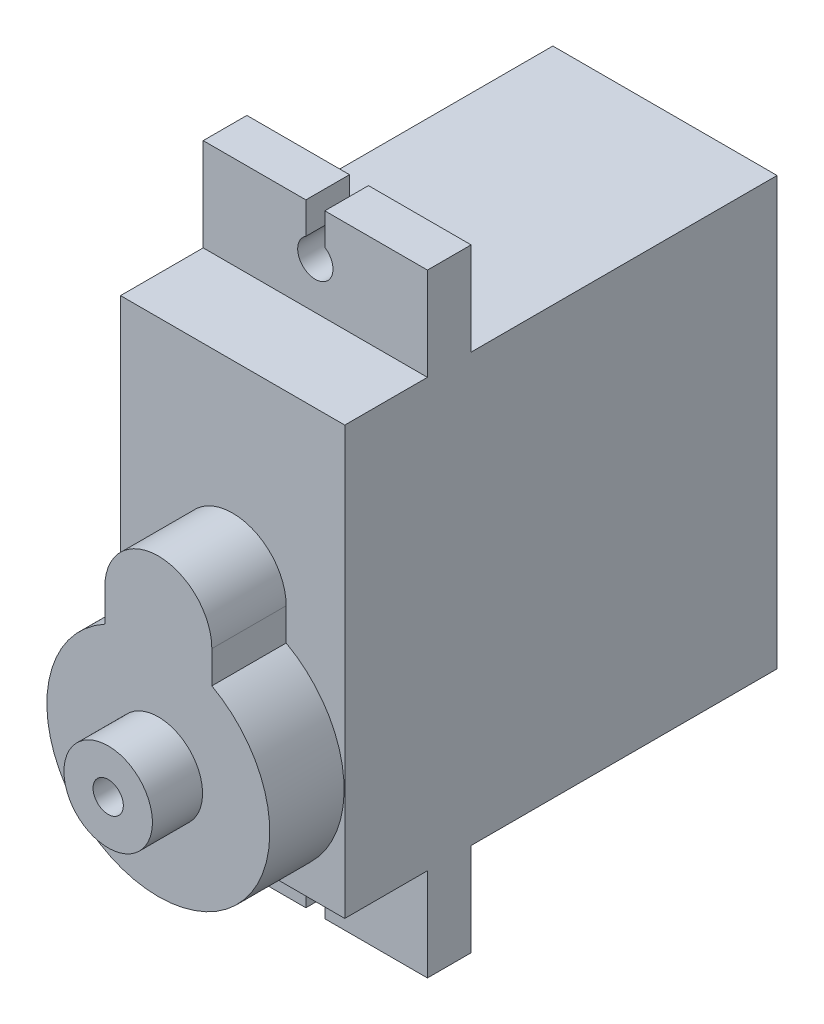
ISO-10303-21;
HEADER;
FILE_DESCRIPTION(('STEP AP214'),'2;1');
FILE_NAME('part.step','',(''),(''),'','','');
FILE_SCHEMA(('AUTOMOTIVE_DESIGN { 1 0 10303 214 1 1 1 1 }'));
ENDSEC;
DATA;
#1=APPLICATION_CONTEXT('core data for automotive mechanical design processes');
#2=APPLICATION_PROTOCOL_DEFINITION('international standard','automotive_design',2000,#1);
#3=PRODUCT_CONTEXT('',#1,'mechanical');
#4=PRODUCT('Part','Part','',(#3));
#5=PRODUCT_RELATED_PRODUCT_CATEGORY('part','',(#4));
#6=PRODUCT_DEFINITION_FORMATION('','',#4);
#7=PRODUCT_DEFINITION_CONTEXT('part definition',#1,'design');
#8=PRODUCT_DEFINITION('design','',#6,#7);
#9=PRODUCT_DEFINITION_SHAPE('','',#8);
#10=(LENGTH_UNIT() NAMED_UNIT(*) SI_UNIT(.MILLI.,.METRE.));
#11=(NAMED_UNIT(*) PLANE_ANGLE_UNIT() SI_UNIT($,.RADIAN.));
#12=(NAMED_UNIT(*) SI_UNIT($,.STERADIAN.) SOLID_ANGLE_UNIT());
#13=UNCERTAINTY_MEASURE_WITH_UNIT(LENGTH_MEASURE(1.E-05),#10,'distance_accuracy_value','');
#14=(GEOMETRIC_REPRESENTATION_CONTEXT(3) GLOBAL_UNCERTAINTY_ASSIGNED_CONTEXT((#13)) GLOBAL_UNIT_ASSIGNED_CONTEXT((#10,
#11,#12)) REPRESENTATION_CONTEXT('',''));
#15=CARTESIAN_POINT('',(0.,0.,0.));
#16=DIRECTION('',(0.,0.,1.));
#17=DIRECTION('',(1.,0.,0.));
#18=AXIS2_PLACEMENT_3D('',#15,#16,#17);
#19=CARTESIAN_POINT('',(6.035,6.,4.));
#20=DIRECTION('',(0.,0.,1.));
#21=DIRECTION('',(1.,0.,0.));
#22=AXIS2_PLACEMENT_3D('',#19,#20,#21);
#23=PLANE('',#22);
#24=CARTESIAN_POINT('',(6.035,6.,4.));
#25=DIRECTION('',(0.,0.,1.));
#26=DIRECTION('',(1.,0.,0.));
#27=AXIS2_PLACEMENT_3D('',#24,#25,#26);
#28=CIRCLE('',#27,6.);
#29=CARTESIAN_POINT('',(3.155,11.2636109278707,4.));
#30=VERTEX_POINT('',#29);
#31=CARTESIAN_POINT('',(8.915,11.2636109278707,4.));
#32=VERTEX_POINT('',#31);
#33=EDGE_CURVE('E274',#30,#32,#28,.T.);
#34=ORIENTED_EDGE('',*,*,#33,.T.);
#35=DIRECTION('',(0.,1.,0.));
#36=VECTOR('',#35,1.);
#37=CARTESIAN_POINT('',(8.915,11.2636109278707,4.));
#38=LINE('',#37,#36);
#39=CARTESIAN_POINT('',(8.915,13.,4.));
#40=VERTEX_POINT('',#39);
#41=EDGE_CURVE('E256',#32,#40,#38,.T.);
#42=ORIENTED_EDGE('',*,*,#41,.T.);
#43=CARTESIAN_POINT('',(6.035,13.,4.));
#44=DIRECTION('',(0.,0.,1.));
#45=DIRECTION('',(1.,0.,0.));
#46=AXIS2_PLACEMENT_3D('',#43,#44,#45);
#47=CIRCLE('',#46,2.88);
#48=CARTESIAN_POINT('',(3.155,13.,4.));
#49=VERTEX_POINT('',#48);
#50=EDGE_CURVE('E249',#40,#49,#47,.T.);
#51=ORIENTED_EDGE('',*,*,#50,.T.);
#52=DIRECTION('',(0.,-1.,0.));
#53=VECTOR('',#52,1.);
#54=CARTESIAN_POINT('',(3.155,13.,4.));
#55=LINE('',#54,#53);
#56=EDGE_CURVE('E252',#49,#30,#55,.T.);
#57=ORIENTED_EDGE('',*,*,#56,.T.);
#58=EDGE_LOOP('',(#34,#42,#51,#57));
#59=FACE_BOUND('',#58,.T.);
#60=CARTESIAN_POINT('',(6.035,6.,4.));
#61=DIRECTION('',(0.,0.,1.));
#62=DIRECTION('',(1.,0.,0.));
#63=AXIS2_PLACEMENT_3D('',#60,#61,#62);
#64=CIRCLE('',#63,2.38);
#65=CARTESIAN_POINT('',(3.655,6.,4.));
#66=VERTEX_POINT('',#65);
#67=EDGE_CURVE('E772',#66,#66,#64,.T.);
#68=ORIENTED_EDGE('',*,*,#67,.F.);
#69=EDGE_LOOP('',(#68));
#70=FACE_BOUND('',#69,.T.);
#71=ADVANCED_FACE('F36',(#59,#70),#23,.T.);
#72=CARTESIAN_POINT('',(0.,-5.,-4.45));
#73=DIRECTION('',(0.,1.,0.));
#74=DIRECTION('',(0.,0.,1.));
#75=AXIS2_PLACEMENT_3D('',#72,#73,#74);
#76=PLANE('',#75);
#77=DIRECTION('',(1.,0.,0.));
#78=VECTOR('',#77,1.);
#79=CARTESIAN_POINT('',(12.07,-5.,-6.8));
#80=LINE('',#79,#78);
#81=CARTESIAN_POINT('',(0.,-5.,-6.8));
#82=VERTEX_POINT('',#81);
#83=CARTESIAN_POINT('',(5.525,-5.,-6.8));
#84=VERTEX_POINT('',#83);
#85=EDGE_CURVE('E378',#82,#84,#80,.T.);
#86=ORIENTED_EDGE('',*,*,#85,.T.);
#87=DIRECTION('',(0.,0.,1.));
#88=VECTOR('',#87,1.);
#89=CARTESIAN_POINT('',(5.525,-5.,-23.270025));
#90=LINE('',#89,#88);
#91=CARTESIAN_POINT('',(5.52500000000001,-5.,-4.45000000000001));
#92=VERTEX_POINT('',#91);
#93=EDGE_CURVE('E205',#84,#92,#90,.T.);
#94=ORIENTED_EDGE('',*,*,#93,.T.);
#95=DIRECTION('',(-1.,0.,0.));
#96=VECTOR('',#95,1.);
#97=CARTESIAN_POINT('',(0.,-5.,-4.45));
#98=LINE('',#97,#96);
#99=CARTESIAN_POINT('',(0.,-5.,-4.45));
#100=VERTEX_POINT('',#99);
#101=EDGE_CURVE('E225',#92,#100,#98,.T.);
#102=ORIENTED_EDGE('',*,*,#101,.T.);
#103=DIRECTION('',(0.,0.,-1.));
#104=VECTOR('',#103,1.);
#105=CARTESIAN_POINT('',(0.,-5.,-6.8));
#106=LINE('',#105,#104);
#107=EDGE_CURVE('E239',#100,#82,#106,.T.);
#108=ORIENTED_EDGE('',*,*,#107,.T.);
#109=EDGE_LOOP('',(#86,#94,#102,#108));
#110=FACE_BOUND('',#109,.T.);
#111=ADVANCED_FACE('F392',(#110),#76,.F.);
#112=CARTESIAN_POINT('',(0.,28.,-6.8));
#113=DIRECTION('',(0.,-1.,0.));
#114=DIRECTION('',(0.,0.,-1.));
#115=AXIS2_PLACEMENT_3D('',#112,#113,#114);
#116=PLANE('',#115);
#117=DIRECTION('',(-1.,0.,0.));
#118=VECTOR('',#117,1.);
#119=CARTESIAN_POINT('',(0.,28.,-6.8));
#120=LINE('',#119,#118);
#121=CARTESIAN_POINT('',(12.07,28.,-6.8));
#122=VERTEX_POINT('',#121);
#123=CARTESIAN_POINT('',(6.545,28.,-6.8));
#124=VERTEX_POINT('',#123);
#125=EDGE_CURVE('E418',#122,#124,#120,.T.);
#126=ORIENTED_EDGE('',*,*,#125,.T.);
#127=DIRECTION('',(0.,0.,1.));
#128=VECTOR('',#127,1.);
#129=CARTESIAN_POINT('',(6.545,28.,-23.270025));
#130=LINE('',#129,#128);
#131=CARTESIAN_POINT('',(6.545,28.,-4.45000000000001));
#132=VERTEX_POINT('',#131);
#133=EDGE_CURVE('E450',#124,#132,#130,.T.);
#134=ORIENTED_EDGE('',*,*,#133,.T.);
#135=DIRECTION('',(1.,0.,0.));
#136=VECTOR('',#135,1.);
#137=CARTESIAN_POINT('',(12.07,28.,-4.45000000000001));
#138=LINE('',#137,#136);
#139=CARTESIAN_POINT('',(12.07,28.,-4.45000000000001));
#140=VERTEX_POINT('',#139);
#141=EDGE_CURVE('E413',#132,#140,#138,.T.);
#142=ORIENTED_EDGE('',*,*,#141,.T.);
#143=DIRECTION('',(0.,0.,-1.));
#144=VECTOR('',#143,1.);
#145=CARTESIAN_POINT('',(12.07,28.,-6.8));
#146=LINE('',#145,#144);
#147=EDGE_CURVE('E349',#140,#122,#146,.T.);
#148=ORIENTED_EDGE('',*,*,#147,.T.);
#149=EDGE_LOOP('',(#126,#134,#142,#148));
#150=FACE_BOUND('',#149,.T.);
#151=ADVANCED_FACE('F466',(#150),#116,.F.);
#152=CARTESIAN_POINT('',(0.,23.,0.));
#153=DIRECTION('',(0.,1.,0.));
#154=DIRECTION('',(0.,0.,1.));
#155=AXIS2_PLACEMENT_3D('',#152,#153,#154);
#156=PLANE('',#155);
#157=DIRECTION('',(-1.,0.,0.));
#158=VECTOR('',#157,1.);
#159=CARTESIAN_POINT('',(0.,23.,-6.8));
#160=LINE('',#159,#158);
#161=CARTESIAN_POINT('',(12.07,23.,-6.8));
#162=VERTEX_POINT('',#161);
#163=CARTESIAN_POINT('',(0.,23.,-6.8));
#164=VERTEX_POINT('',#163);
#165=EDGE_CURVE('E366',#162,#164,#160,.T.);
#166=ORIENTED_EDGE('',*,*,#165,.F.);
#167=DIRECTION('',(0.,0.,-1.));
#168=VECTOR('',#167,1.);
#169=CARTESIAN_POINT('',(12.07,23.,0.));
#170=LINE('',#169,#168);
#171=CARTESIAN_POINT('',(12.07,23.,-23.27));
#172=VERTEX_POINT('',#171);
#173=EDGE_CURVE('E323',#162,#172,#170,.T.);
#174=ORIENTED_EDGE('',*,*,#173,.T.);
#175=DIRECTION('',(-1.,0.,0.));
#176=VECTOR('',#175,1.);
#177=CARTESIAN_POINT('',(12.07,23.,-23.27));
#178=LINE('',#177,#176);
#179=CARTESIAN_POINT('',(0.,23.,-23.27));
#180=VERTEX_POINT('',#179);
#181=EDGE_CURVE('E305',#172,#180,#178,.T.);
#182=ORIENTED_EDGE('',*,*,#181,.T.);
#183=DIRECTION('',(0.,0.,1.));
#184=VECTOR('',#183,1.);
#185=CARTESIAN_POINT('',(0.,23.,-23.27));
#186=LINE('',#185,#184);
#187=EDGE_CURVE('E290',#180,#164,#186,.T.);
#188=ORIENTED_EDGE('',*,*,#187,.T.);
#189=EDGE_LOOP('',(#166,#174,#182,#188));
#190=FACE_BOUND('',#189,.T.);
#191=ADVANCED_FACE('F472',(#190),#156,.T.);
#192=CARTESIAN_POINT('',(0.,0.,0.));
#193=DIRECTION('',(0.,1.,0.));
#194=DIRECTION('',(0.,0.,1.));
#195=AXIS2_PLACEMENT_3D('',#192,#193,#194);
#196=PLANE('',#195);
#197=DIRECTION('',(1.,0.,0.));
#198=VECTOR('',#197,1.);
#199=CARTESIAN_POINT('',(12.07,0.,-6.8));
#200=LINE('',#199,#198);
#201=CARTESIAN_POINT('',(0.,0.,-6.8));
#202=VERTEX_POINT('',#201);
#203=CARTESIAN_POINT('',(12.07,0.,-6.8));
#204=VERTEX_POINT('',#203);
#205=EDGE_CURVE('E233',#202,#204,#200,.T.);
#206=ORIENTED_EDGE('',*,*,#205,.F.);
#207=DIRECTION('',(0.,0.,1.));
#208=VECTOR('',#207,1.);
#209=CARTESIAN_POINT('',(0.,0.,-23.27));
#210=LINE('',#209,#208);
#211=CARTESIAN_POINT('',(0.,0.,-23.27));
#212=VERTEX_POINT('',#211);
#213=EDGE_CURVE('E316',#212,#202,#210,.T.);
#214=ORIENTED_EDGE('',*,*,#213,.F.);
#215=DIRECTION('',(-1.,0.,0.));
#216=VECTOR('',#215,1.);
#217=CARTESIAN_POINT('',(12.07,0.,-23.27));
#218=LINE('',#217,#216);
#219=CARTESIAN_POINT('',(12.07,0.,-23.27));
#220=VERTEX_POINT('',#219);
#221=EDGE_CURVE('E306',#220,#212,#218,.T.);
#222=ORIENTED_EDGE('',*,*,#221,.F.);
#223=DIRECTION('',(0.,0.,-1.));
#224=VECTOR('',#223,1.);
#225=CARTESIAN_POINT('',(12.07,0.,0.));
#226=LINE('',#225,#224);
#227=EDGE_CURVE('E311',#204,#220,#226,.T.);
#228=ORIENTED_EDGE('',*,*,#227,.F.);
#229=EDGE_LOOP('',(#206,#214,#222,#228));
#230=FACE_BOUND('',#229,.T.);
#231=ADVANCED_FACE('F475',(#230),#196,.F.);
#232=DIRECTION('',(-1.,0.,0.));
#233=VECTOR('',#232,1.);
#234=CARTESIAN_POINT('',(0.,0.,-4.45));
#235=LINE('',#234,#233);
#236=CARTESIAN_POINT('',(12.07,0.,-4.45));
#237=VERTEX_POINT('',#236);
#238=CARTESIAN_POINT('',(0.,0.,-4.45));
#239=VERTEX_POINT('',#238);
#240=EDGE_CURVE('E236',#237,#239,#235,.T.);
#241=ORIENTED_EDGE('',*,*,#240,.F.);
#242=CARTESIAN_POINT('',(12.07,0.,0.));
#243=VERTEX_POINT('',#242);
#244=EDGE_CURVE('E308',#243,#237,#226,.T.);
#245=ORIENTED_EDGE('',*,*,#244,.F.);
#246=DIRECTION('',(1.,0.,0.));
#247=VECTOR('',#246,1.);
#248=CARTESIAN_POINT('',(0.,0.,0.));
#249=LINE('',#248,#247);
#250=CARTESIAN_POINT('',(6.035,0.,0.));
#251=VERTEX_POINT('',#250);
#252=EDGE_CURVE('E315',#251,#243,#249,.T.);
#253=ORIENTED_EDGE('',*,*,#252,.F.);
#254=CARTESIAN_POINT('',(0.,0.,0.));
#255=VERTEX_POINT('',#254);
#256=EDGE_CURVE('E312',#255,#251,#249,.T.);
#257=ORIENTED_EDGE('',*,*,#256,.F.);
#258=EDGE_CURVE('E277',#239,#255,#210,.T.);
#259=ORIENTED_EDGE('',*,*,#258,.F.);
#260=EDGE_LOOP('',(#241,#245,#253,#257,#259));
#261=FACE_BOUND('',#260,.T.);
#262=ADVANCED_FACE('F477',(#261),#196,.F.);
#263=CARTESIAN_POINT('',(0.,23.,0.));
#264=DIRECTION('',(0.,0.,-1.));
#265=DIRECTION('',(-1.,0.,0.));
#266=AXIS2_PLACEMENT_3D('',#263,#264,#265);
#267=PLANE('',#266);
#268=DIRECTION('',(0.,-1.,0.));
#269=VECTOR('',#268,1.);
#270=CARTESIAN_POINT('',(3.155,13.,0.));
#271=LINE('',#270,#269);
#272=CARTESIAN_POINT('',(3.155,13.,0.));
#273=VERTEX_POINT('',#272);
#274=CARTESIAN_POINT('',(3.155,11.2636109278707,0.));
#275=VERTEX_POINT('',#274);
#276=EDGE_CURVE('E261',#273,#275,#271,.T.);
#277=ORIENTED_EDGE('',*,*,#276,.F.);
#278=CARTESIAN_POINT('',(6.035,13.,0.));
#279=DIRECTION('',(0.,0.,1.));
#280=DIRECTION('',(1.,0.,0.));
#281=AXIS2_PLACEMENT_3D('',#278,#279,#280);
#282=CIRCLE('',#281,2.88);
#283=CARTESIAN_POINT('',(8.915,13.,0.));
#284=VERTEX_POINT('',#283);
#285=EDGE_CURVE('E248',#284,#273,#282,.T.);
#286=ORIENTED_EDGE('',*,*,#285,.F.);
#287=DIRECTION('',(0.,1.,0.));
#288=VECTOR('',#287,1.);
#289=CARTESIAN_POINT('',(8.915,11.2636109278707,0.));
#290=LINE('',#289,#288);
#291=CARTESIAN_POINT('',(8.915,11.2636109278707,0.));
#292=VERTEX_POINT('',#291);
#293=EDGE_CURVE('E253',#292,#284,#290,.T.);
#294=ORIENTED_EDGE('',*,*,#293,.F.);
#295=CARTESIAN_POINT('',(6.035,6.,0.));
#296=DIRECTION('',(0.,0.,1.));
#297=DIRECTION('',(1.,0.,0.));
#298=AXIS2_PLACEMENT_3D('',#295,#296,#297);
#299=CIRCLE('',#298,6.);
#300=EDGE_CURVE('E278',#251,#292,#299,.T.);
#301=ORIENTED_EDGE('',*,*,#300,.F.);
#302=ORIENTED_EDGE('',*,*,#252,.T.);
#303=DIRECTION('',(0.,-1.,0.));
#304=VECTOR('',#303,1.);
#305=CARTESIAN_POINT('',(12.07,23.,0.));
#306=LINE('',#305,#304);
#307=CARTESIAN_POINT('',(12.07,23.,0.));
#308=VERTEX_POINT('',#307);
#309=EDGE_CURVE('E296',#308,#243,#306,.T.);
#310=ORIENTED_EDGE('',*,*,#309,.F.);
#311=DIRECTION('',(1.,0.,0.));
#312=VECTOR('',#311,1.);
#313=CARTESIAN_POINT('',(0.,23.,0.));
#314=LINE('',#313,#312);
#315=CARTESIAN_POINT('',(0.,23.,0.));
#316=VERTEX_POINT('',#315);
#317=EDGE_CURVE('E283',#316,#308,#314,.T.);
#318=ORIENTED_EDGE('',*,*,#317,.F.);
#319=DIRECTION('',(0.,-1.,0.));
#320=VECTOR('',#319,1.);
#321=CARTESIAN_POINT('',(0.,23.,0.));
#322=LINE('',#321,#320);
#323=EDGE_CURVE('E292',#316,#255,#322,.T.);
#324=ORIENTED_EDGE('',*,*,#323,.T.);
#325=ORIENTED_EDGE('',*,*,#256,.T.);
#326=EDGE_CURVE('E273',#275,#251,#299,.T.);
#327=ORIENTED_EDGE('',*,*,#326,.F.);
#328=EDGE_LOOP('',(#277,#286,#294,#301,#302,#310,#318,#324,#325,#327));
#329=FACE_BOUND('',#328,.T.);
#330=ADVANCED_FACE('F338',(#329),#267,.F.);
#331=CARTESIAN_POINT('',(6.035,6.,4.));
#332=DIRECTION('',(0.,0.,-1.));
#333=DIRECTION('',(-1.,0.,0.));
#334=AXIS2_PLACEMENT_3D('',#331,#332,#333);
#335=CYLINDRICAL_SURFACE('',#334,6.);
#336=DIRECTION('',(0.,0.,-1.));
#337=VECTOR('',#336,1.);
#338=CARTESIAN_POINT('',(3.155,11.2636109278707,4.));
#339=LINE('',#338,#337);
#340=EDGE_CURVE('E268',#30,#275,#339,.T.);
#341=ORIENTED_EDGE('',*,*,#340,.T.);
#342=ORIENTED_EDGE('',*,*,#326,.T.);
#343=ORIENTED_EDGE('',*,*,#300,.T.);
#344=DIRECTION('',(0.,0.,-1.));
#345=VECTOR('',#344,1.);
#346=CARTESIAN_POINT('',(8.915,11.2636109278707,4.));
#347=LINE('',#346,#345);
#348=EDGE_CURVE('E266',#32,#292,#347,.T.);
#349=ORIENTED_EDGE('',*,*,#348,.F.);
#350=ORIENTED_EDGE('',*,*,#33,.F.);
#351=EDGE_LOOP('',(#341,#342,#343,#349,#350));
#352=FACE_BOUND('',#351,.T.);
#353=ADVANCED_FACE('F564',(#352),#335,.T.);
#354=CARTESIAN_POINT('',(0.,23.,-23.27));
#355=DIRECTION('',(1.,0.,0.));
#356=DIRECTION('',(0.,0.,-1.));
#357=AXIS2_PLACEMENT_3D('',#354,#355,#356);
#358=PLANE('',#357);
#359=ORIENTED_EDGE('',*,*,#213,.T.);
#360=DIRECTION('',(0.,1.,0.));
#361=VECTOR('',#360,1.);
#362=CARTESIAN_POINT('',(0.,-5.,-6.8));
#363=LINE('',#362,#361);
#364=EDGE_CURVE('E245',#82,#202,#363,.T.);
#365=ORIENTED_EDGE('',*,*,#364,.F.);
#366=ORIENTED_EDGE('',*,*,#107,.F.);
#367=DIRECTION('',(0.,1.,0.));
#368=VECTOR('',#367,1.);
#369=CARTESIAN_POINT('',(0.,-5.,-4.45));
#370=LINE('',#369,#368);
#371=EDGE_CURVE('E224',#100,#239,#370,.T.);
#372=ORIENTED_EDGE('',*,*,#371,.T.);
#373=ORIENTED_EDGE('',*,*,#258,.T.);
#374=ORIENTED_EDGE('',*,*,#323,.F.);
#375=CARTESIAN_POINT('',(0.,23.,-4.45));
#376=VERTEX_POINT('',#375);
#377=EDGE_CURVE('E287',#376,#316,#186,.T.);
#378=ORIENTED_EDGE('',*,*,#377,.F.);
#379=DIRECTION('',(0.,-1.,0.));
#380=VECTOR('',#379,1.);
#381=CARTESIAN_POINT('',(0.,28.,-4.45));
#382=LINE('',#381,#380);
#383=CARTESIAN_POINT('',(0.,28.,-4.45));
#384=VERTEX_POINT('',#383);
#385=EDGE_CURVE('E237',#384,#376,#382,.T.);
#386=ORIENTED_EDGE('',*,*,#385,.F.);
#387=DIRECTION('',(0.,0.,1.));
#388=VECTOR('',#387,1.);
#389=CARTESIAN_POINT('',(0.,28.,-4.45));
#390=LINE('',#389,#388);
#391=CARTESIAN_POINT('',(0.,28.,-6.8));
#392=VERTEX_POINT('',#391);
#393=EDGE_CURVE('E370',#392,#384,#390,.T.);
#394=ORIENTED_EDGE('',*,*,#393,.F.);
#395=DIRECTION('',(0.,-1.,0.));
#396=VECTOR('',#395,1.);
#397=CARTESIAN_POINT('',(0.,28.,-6.8));
#398=LINE('',#397,#396);
#399=EDGE_CURVE('E357',#392,#164,#398,.T.);
#400=ORIENTED_EDGE('',*,*,#399,.T.);
#401=ORIENTED_EDGE('',*,*,#187,.F.);
#402=DIRECTION('',(0.,-1.,0.));
#403=VECTOR('',#402,1.);
#404=CARTESIAN_POINT('',(0.,23.,-23.27));
#405=LINE('',#404,#403);
#406=EDGE_CURVE('E302',#180,#212,#405,.T.);
#407=ORIENTED_EDGE('',*,*,#406,.T.);
#408=EDGE_LOOP('',(#359,#365,#366,#372,#373,#374,#378,#386,#394,#400,#401,#407));
#409=FACE_BOUND('',#408,.T.);
#410=ADVANCED_FACE('F38',(#409),#358,.F.);
#411=CARTESIAN_POINT('',(12.07,23.,0.));
#412=DIRECTION('',(-1.,0.,0.));
#413=DIRECTION('',(0.,0.,1.));
#414=AXIS2_PLACEMENT_3D('',#411,#412,#413);
#415=PLANE('',#414);
#416=ORIENTED_EDGE('',*,*,#244,.T.);
#417=DIRECTION('',(0.,1.,0.));
#418=VECTOR('',#417,1.);
#419=CARTESIAN_POINT('',(12.07,-5.,-4.45));
#420=LINE('',#419,#418);
#421=CARTESIAN_POINT('',(12.07,-5.,-4.45));
#422=VERTEX_POINT('',#421);
#423=EDGE_CURVE('E228',#422,#237,#420,.T.);
#424=ORIENTED_EDGE('',*,*,#423,.F.);
#425=DIRECTION('',(0.,0.,1.));
#426=VECTOR('',#425,1.);
#427=CARTESIAN_POINT('',(12.07,-5.,-4.45));
#428=LINE('',#427,#426);
#429=CARTESIAN_POINT('',(12.07,-5.,-6.8));
#430=VERTEX_POINT('',#429);
#431=EDGE_CURVE('E222',#430,#422,#428,.T.);
#432=ORIENTED_EDGE('',*,*,#431,.F.);
#433=DIRECTION('',(0.,1.,0.));
#434=VECTOR('',#433,1.);
#435=CARTESIAN_POINT('',(12.07,-5.,-6.8));
#436=LINE('',#435,#434);
#437=EDGE_CURVE('E242',#430,#204,#436,.T.);
#438=ORIENTED_EDGE('',*,*,#437,.T.);
#439=ORIENTED_EDGE('',*,*,#227,.T.);
#440=DIRECTION('',(0.,-1.,0.));
#441=VECTOR('',#440,1.);
#442=CARTESIAN_POINT('',(12.07,23.,-23.27));
#443=LINE('',#442,#441);
#444=EDGE_CURVE('E299',#172,#220,#443,.T.);
#445=ORIENTED_EDGE('',*,*,#444,.F.);
#446=ORIENTED_EDGE('',*,*,#173,.F.);
#447=DIRECTION('',(0.,-1.,0.));
#448=VECTOR('',#447,1.);
#449=CARTESIAN_POINT('',(12.07,28.,-6.8));
#450=LINE('',#449,#448);
#451=EDGE_CURVE('E352',#122,#162,#450,.T.);
#452=ORIENTED_EDGE('',*,*,#451,.F.);
#453=ORIENTED_EDGE('',*,*,#147,.F.);
#454=DIRECTION('',(0.,-1.,0.));
#455=VECTOR('',#454,1.);
#456=CARTESIAN_POINT('',(12.07,28.,-4.45000000000001));
#457=LINE('',#456,#455);
#458=CARTESIAN_POINT('',(12.07,23.,-4.45000000000001));
#459=VERTEX_POINT('',#458);
#460=EDGE_CURVE('E347',#140,#459,#457,.T.);
#461=ORIENTED_EDGE('',*,*,#460,.T.);
#462=EDGE_CURVE('E319',#308,#459,#170,.T.);
#463=ORIENTED_EDGE('',*,*,#462,.F.);
#464=ORIENTED_EDGE('',*,*,#309,.T.);
#465=EDGE_LOOP('',(#416,#424,#432,#438,#439,#445,#446,#452,#453,#461,#463,#464));
#466=FACE_BOUND('',#465,.T.);
#467=ADVANCED_FACE('F344',(#466),#415,.F.);
#468=CARTESIAN_POINT('',(12.07,23.,-23.27));
#469=DIRECTION('',(0.,0.,1.));
#470=DIRECTION('',(1.,0.,0.));
#471=AXIS2_PLACEMENT_3D('',#468,#469,#470);
#472=PLANE('',#471);
#473=ORIENTED_EDGE('',*,*,#221,.T.);
#474=ORIENTED_EDGE('',*,*,#406,.F.);
#475=ORIENTED_EDGE('',*,*,#181,.F.);
#476=ORIENTED_EDGE('',*,*,#444,.T.);
#477=EDGE_LOOP('',(#473,#474,#475,#476));
#478=FACE_BOUND('',#477,.T.);
#479=ADVANCED_FACE('F471',(#478),#472,.F.);
#480=DIRECTION('',(1.,0.,0.));
#481=VECTOR('',#480,1.);
#482=CARTESIAN_POINT('',(12.07,23.,-4.45000000000001));
#483=LINE('',#482,#481);
#484=EDGE_CURVE('E360',#376,#459,#483,.T.);
#485=ORIENTED_EDGE('',*,*,#484,.F.);
#486=ORIENTED_EDGE('',*,*,#377,.T.);
#487=ORIENTED_EDGE('',*,*,#317,.T.);
#488=ORIENTED_EDGE('',*,*,#462,.T.);
#489=EDGE_LOOP('',(#485,#486,#487,#488));
#490=FACE_BOUND('',#489,.T.);
#491=ADVANCED_FACE('F333',(#490),#156,.T.);
#492=CARTESIAN_POINT('',(6.035,13.,4.));
#493=DIRECTION('',(0.,0.,-1.));
#494=DIRECTION('',(-1.,0.,0.));
#495=AXIS2_PLACEMENT_3D('',#492,#493,#494);
#496=CYLINDRICAL_SURFACE('',#495,2.88);
#497=ORIENTED_EDGE('',*,*,#285,.T.);
#498=DIRECTION('',(0.,0.,-1.));
#499=VECTOR('',#498,1.);
#500=CARTESIAN_POINT('',(3.155,13.,4.));
#501=LINE('',#500,#499);
#502=EDGE_CURVE('E271',#49,#273,#501,.T.);
#503=ORIENTED_EDGE('',*,*,#502,.F.);
#504=ORIENTED_EDGE('',*,*,#50,.F.);
#505=DIRECTION('',(0.,0.,-1.));
#506=VECTOR('',#505,1.);
#507=CARTESIAN_POINT('',(8.915,13.,4.));
#508=LINE('',#507,#506);
#509=EDGE_CURVE('E258',#40,#284,#508,.T.);
#510=ORIENTED_EDGE('',*,*,#509,.T.);
#511=EDGE_LOOP('',(#497,#503,#504,#510));
#512=FACE_BOUND('',#511,.T.);
#513=ADVANCED_FACE('F549',(#512),#496,.T.);
#514=CARTESIAN_POINT('',(3.155,13.,4.));
#515=DIRECTION('',(1.,0.,0.));
#516=DIRECTION('',(0.,0.,-1.));
#517=AXIS2_PLACEMENT_3D('',#514,#515,#516);
#518=PLANE('',#517);
#519=ORIENTED_EDGE('',*,*,#276,.T.);
#520=ORIENTED_EDGE('',*,*,#340,.F.);
#521=ORIENTED_EDGE('',*,*,#56,.F.);
#522=ORIENTED_EDGE('',*,*,#502,.T.);
#523=EDGE_LOOP('',(#519,#520,#521,#522));
#524=FACE_BOUND('',#523,.T.);
#525=ADVANCED_FACE('F546',(#524),#518,.F.);
#526=CARTESIAN_POINT('',(8.915,11.2636109278707,4.));
#527=DIRECTION('',(-1.,0.,0.));
#528=DIRECTION('',(0.,0.,1.));
#529=AXIS2_PLACEMENT_3D('',#526,#527,#528);
#530=PLANE('',#529);
#531=ORIENTED_EDGE('',*,*,#293,.T.);
#532=ORIENTED_EDGE('',*,*,#509,.F.);
#533=ORIENTED_EDGE('',*,*,#41,.F.);
#534=ORIENTED_EDGE('',*,*,#348,.T.);
#535=EDGE_LOOP('',(#531,#532,#533,#534));
#536=FACE_BOUND('',#535,.T.);
#537=ADVANCED_FACE('F543',(#536),#530,.F.);
#538=CARTESIAN_POINT('',(12.07,-5.,-6.8));
#539=DIRECTION('',(0.,0.,1.));
#540=DIRECTION('',(1.,0.,0.));
#541=AXIS2_PLACEMENT_3D('',#538,#539,#540);
#542=PLANE('',#541);
#543=CARTESIAN_POINT('',(6.035,-2.5,-6.8));
#544=DIRECTION('',(0.,0.,1.));
#545=DIRECTION('',(1.,0.,0.));
#546=AXIS2_PLACEMENT_3D('',#543,#544,#545);
#547=CIRCLE('',#546,0.95);
#548=CARTESIAN_POINT('',(6.545,-3.30149859638055,-6.8));
#549=VERTEX_POINT('',#548);
#550=CARTESIAN_POINT('',(5.525,-3.30149859638055,-6.8));
#551=VERTEX_POINT('',#550);
#552=EDGE_CURVE('E398',#549,#551,#547,.T.);
#553=ORIENTED_EDGE('',*,*,#552,.T.);
#554=DIRECTION('',(0.,-1.,0.));
#555=VECTOR('',#554,1.);
#556=CARTESIAN_POINT('',(5.525,-5.,-6.8));
#557=LINE('',#556,#555);
#558=EDGE_CURVE('E51',#551,#84,#557,.T.);
#559=ORIENTED_EDGE('',*,*,#558,.T.);
#560=ORIENTED_EDGE('',*,*,#85,.F.);
#561=ORIENTED_EDGE('',*,*,#364,.T.);
#562=ORIENTED_EDGE('',*,*,#205,.T.);
#563=ORIENTED_EDGE('',*,*,#437,.F.);
#564=CARTESIAN_POINT('',(6.545,-5.,-6.8));
#565=VERTEX_POINT('',#564);
#566=EDGE_CURVE('E377',#565,#430,#80,.T.);
#567=ORIENTED_EDGE('',*,*,#566,.F.);
#568=DIRECTION('',(0.,1.,0.));
#569=VECTOR('',#568,1.);
#570=CARTESIAN_POINT('',(6.545,-5.,-6.8));
#571=LINE('',#570,#569);
#572=EDGE_CURVE('E201',#565,#549,#571,.T.);
#573=ORIENTED_EDGE('',*,*,#572,.T.);
#574=EDGE_LOOP('',(#553,#559,#560,#561,#562,#563,#567,#573));
#575=FACE_BOUND('',#574,.T.);
#576=ADVANCED_FACE('F385',(#575),#542,.F.);
#577=CARTESIAN_POINT('',(0.,-5.,-4.45));
#578=DIRECTION('',(0.,0.,-1.));
#579=DIRECTION('',(-1.,0.,0.));
#580=AXIS2_PLACEMENT_3D('',#577,#578,#579);
#581=PLANE('',#580);
#582=ORIENTED_EDGE('',*,*,#101,.F.);
#583=DIRECTION('',(0.,-1.,0.));
#584=VECTOR('',#583,1.);
#585=CARTESIAN_POINT('',(5.525,-2.5,-4.45000000000001));
#586=LINE('',#585,#584);
#587=CARTESIAN_POINT('',(5.525,-3.30149859638055,-4.45000000000001));
#588=VERTEX_POINT('',#587);
#589=EDGE_CURVE('E206',#588,#92,#586,.T.);
#590=ORIENTED_EDGE('',*,*,#589,.F.);
#591=CARTESIAN_POINT('',(6.035,-2.5,-4.45));
#592=DIRECTION('',(0.,0.,1.));
#593=DIRECTION('',(-1.,0.,0.));
#594=AXIS2_PLACEMENT_3D('',#591,#592,#593);
#595=CIRCLE('',#594,0.95);
#596=CARTESIAN_POINT('',(6.545,-3.30149859638055,-4.45));
#597=VERTEX_POINT('',#596);
#598=EDGE_CURVE('E217',#597,#588,#595,.T.);
#599=ORIENTED_EDGE('',*,*,#598,.F.);
#600=DIRECTION('',(0.,1.,0.));
#601=VECTOR('',#600,1.);
#602=CARTESIAN_POINT('',(6.545,-2.5,-4.45000000000001));
#603=LINE('',#602,#601);
#604=CARTESIAN_POINT('',(6.545,-5.,-4.45000000000001));
#605=VERTEX_POINT('',#604);
#606=EDGE_CURVE('E59',#605,#597,#603,.T.);
#607=ORIENTED_EDGE('',*,*,#606,.F.);
#608=EDGE_CURVE('E214',#422,#605,#98,.T.);
#609=ORIENTED_EDGE('',*,*,#608,.F.);
#610=ORIENTED_EDGE('',*,*,#423,.T.);
#611=ORIENTED_EDGE('',*,*,#240,.T.);
#612=ORIENTED_EDGE('',*,*,#371,.F.);
#613=EDGE_LOOP('',(#582,#590,#599,#607,#609,#610,#611,#612));
#614=FACE_BOUND('',#613,.T.);
#615=ADVANCED_FACE('F212',(#614),#581,.F.);
#616=ORIENTED_EDGE('',*,*,#608,.T.);
#617=DIRECTION('',(0.,0.,1.));
#618=VECTOR('',#617,1.);
#619=CARTESIAN_POINT('',(6.545,-5.,-23.270025));
#620=LINE('',#619,#618);
#621=EDGE_CURVE('E198',#565,#605,#620,.T.);
#622=ORIENTED_EDGE('',*,*,#621,.F.);
#623=ORIENTED_EDGE('',*,*,#566,.T.);
#624=ORIENTED_EDGE('',*,*,#431,.T.);
#625=EDGE_LOOP('',(#616,#622,#623,#624));
#626=FACE_BOUND('',#625,.T.);
#627=ADVANCED_FACE('F220',(#626),#76,.F.);
#628=CARTESIAN_POINT('',(12.07,28.,-4.45000000000001));
#629=DIRECTION('',(0.,0.,-1.));
#630=DIRECTION('',(-1.,0.,0.));
#631=AXIS2_PLACEMENT_3D('',#628,#629,#630);
#632=PLANE('',#631);
#633=ORIENTED_EDGE('',*,*,#141,.F.);
#634=DIRECTION('',(0.,1.,0.));
#635=VECTOR('',#634,1.);
#636=CARTESIAN_POINT('',(6.545,28.,-4.45000000000001));
#637=LINE('',#636,#635);
#638=CARTESIAN_POINT('',(6.545,26.3014985963806,-4.45000000000001));
#639=VERTEX_POINT('',#638);
#640=EDGE_CURVE('E444',#639,#132,#637,.T.);
#641=ORIENTED_EDGE('',*,*,#640,.F.);
#642=CARTESIAN_POINT('',(6.035,25.5,-4.45));
#643=DIRECTION('',(0.,0.,1.));
#644=DIRECTION('',(1.,0.,0.));
#645=AXIS2_PLACEMENT_3D('',#642,#643,#644);
#646=CIRCLE('',#645,0.95);
#647=CARTESIAN_POINT('',(5.525,26.3014985963806,-4.45));
#648=VERTEX_POINT('',#647);
#649=EDGE_CURVE('E401',#648,#639,#646,.T.);
#650=ORIENTED_EDGE('',*,*,#649,.F.);
#651=DIRECTION('',(0.,-1.,0.));
#652=VECTOR('',#651,1.);
#653=CARTESIAN_POINT('',(5.52500000000001,28.,-4.45000000000001));
#654=LINE('',#653,#652);
#655=CARTESIAN_POINT('',(5.52500000000001,28.,-4.45000000000001));
#656=VERTEX_POINT('',#655);
#657=EDGE_CURVE('E440',#656,#648,#654,.T.);
#658=ORIENTED_EDGE('',*,*,#657,.F.);
#659=EDGE_CURVE('E414',#384,#656,#138,.T.);
#660=ORIENTED_EDGE('',*,*,#659,.F.);
#661=ORIENTED_EDGE('',*,*,#385,.T.);
#662=ORIENTED_EDGE('',*,*,#484,.T.);
#663=ORIENTED_EDGE('',*,*,#460,.F.);
#664=EDGE_LOOP('',(#633,#641,#650,#658,#660,#661,#662,#663));
#665=FACE_BOUND('',#664,.T.);
#666=ADVANCED_FACE('F437',(#665),#632,.F.);
#667=CARTESIAN_POINT('',(0.,28.,-6.8));
#668=DIRECTION('',(0.,0.,1.));
#669=DIRECTION('',(1.,0.,0.));
#670=AXIS2_PLACEMENT_3D('',#667,#668,#669);
#671=PLANE('',#670);
#672=CARTESIAN_POINT('',(6.035,25.5,-6.8));
#673=DIRECTION('',(0.,0.,1.));
#674=DIRECTION('',(1.,0.,0.));
#675=AXIS2_PLACEMENT_3D('',#672,#673,#674);
#676=CIRCLE('',#675,0.95);
#677=CARTESIAN_POINT('',(5.525,26.3014985963806,-6.8));
#678=VERTEX_POINT('',#677);
#679=CARTESIAN_POINT('',(6.545,26.3014985963806,-6.8));
#680=VERTEX_POINT('',#679);
#681=EDGE_CURVE('E410',#678,#680,#676,.T.);
#682=ORIENTED_EDGE('',*,*,#681,.T.);
#683=DIRECTION('',(0.,1.,0.));
#684=VECTOR('',#683,1.);
#685=CARTESIAN_POINT('',(6.545,28.,-6.8));
#686=LINE('',#685,#684);
#687=EDGE_CURVE('E399',#680,#124,#686,.T.);
#688=ORIENTED_EDGE('',*,*,#687,.T.);
#689=ORIENTED_EDGE('',*,*,#125,.F.);
#690=ORIENTED_EDGE('',*,*,#451,.T.);
#691=ORIENTED_EDGE('',*,*,#165,.T.);
#692=ORIENTED_EDGE('',*,*,#399,.F.);
#693=CARTESIAN_POINT('',(5.525,28.,-6.8));
#694=VERTEX_POINT('',#693);
#695=EDGE_CURVE('E417',#694,#392,#120,.T.);
#696=ORIENTED_EDGE('',*,*,#695,.F.);
#697=DIRECTION('',(0.,-1.,0.));
#698=VECTOR('',#697,1.);
#699=CARTESIAN_POINT('',(5.525,28.,-6.8));
#700=LINE('',#699,#698);
#701=EDGE_CURVE('E404',#694,#678,#700,.T.);
#702=ORIENTED_EDGE('',*,*,#701,.T.);
#703=EDGE_LOOP('',(#682,#688,#689,#690,#691,#692,#696,#702));
#704=FACE_BOUND('',#703,.T.);
#705=ADVANCED_FACE('F435',(#704),#671,.F.);
#706=ORIENTED_EDGE('',*,*,#659,.T.);
#707=DIRECTION('',(0.,0.,1.));
#708=VECTOR('',#707,1.);
#709=CARTESIAN_POINT('',(5.525,28.,-23.270025));
#710=LINE('',#709,#708);
#711=EDGE_CURVE('E431',#694,#656,#710,.T.);
#712=ORIENTED_EDGE('',*,*,#711,.F.);
#713=ORIENTED_EDGE('',*,*,#695,.T.);
#714=ORIENTED_EDGE('',*,*,#393,.T.);
#715=EDGE_LOOP('',(#706,#712,#713,#714));
#716=FACE_BOUND('',#715,.T.);
#717=ADVANCED_FACE('F428',(#716),#116,.F.);
#718=CARTESIAN_POINT('',(6.035,25.5,-23.270025));
#719=DIRECTION('',(0.,0.,1.));
#720=DIRECTION('',(1.,0.,0.));
#721=AXIS2_PLACEMENT_3D('',#718,#719,#720);
#722=CYLINDRICAL_SURFACE('',#721,0.95);
#723=ORIENTED_EDGE('',*,*,#649,.T.);
#724=DIRECTION('',(0.,0.,1.));
#725=VECTOR('',#724,1.);
#726=CARTESIAN_POINT('',(6.545,26.3014985963806,-23.270025));
#727=LINE('',#726,#725);
#728=EDGE_CURVE('E456',#639,#680,#727,.F.);
#729=ORIENTED_EDGE('',*,*,#728,.T.);
#730=ORIENTED_EDGE('',*,*,#681,.F.);
#731=DIRECTION('',(0.,0.,1.));
#732=VECTOR('',#731,1.);
#733=CARTESIAN_POINT('',(5.525,26.3014985963806,-23.270025));
#734=LINE('',#733,#732);
#735=EDGE_CURVE('E295',#678,#648,#734,.T.);
#736=ORIENTED_EDGE('',*,*,#735,.T.);
#737=EDGE_LOOP('',(#723,#729,#730,#736));
#738=FACE_BOUND('',#737,.T.);
#739=ADVANCED_FACE('F455',(#738),#722,.F.);
#740=CARTESIAN_POINT('',(6.035,-2.5,-23.270025));
#741=DIRECTION('',(0.,0.,1.));
#742=DIRECTION('',(1.,0.,0.));
#743=AXIS2_PLACEMENT_3D('',#740,#741,#742);
#744=CYLINDRICAL_SURFACE('',#743,0.95);
#745=ORIENTED_EDGE('',*,*,#598,.T.);
#746=DIRECTION('',(0.,0.,1.));
#747=VECTOR('',#746,1.);
#748=CARTESIAN_POINT('',(5.525,-3.30149859638055,-23.270025));
#749=LINE('',#748,#747);
#750=EDGE_CURVE('E44',#588,#551,#749,.F.);
#751=ORIENTED_EDGE('',*,*,#750,.T.);
#752=ORIENTED_EDGE('',*,*,#552,.F.);
#753=DIRECTION('',(0.,0.,1.));
#754=VECTOR('',#753,1.);
#755=CARTESIAN_POINT('',(6.545,-3.30149859638055,-23.270025));
#756=LINE('',#755,#754);
#757=EDGE_CURVE('E397',#549,#597,#756,.T.);
#758=ORIENTED_EDGE('',*,*,#757,.T.);
#759=EDGE_LOOP('',(#745,#751,#752,#758));
#760=FACE_BOUND('',#759,.T.);
#761=ADVANCED_FACE('F395',(#760),#744,.F.);
#762=CARTESIAN_POINT('',(5.525,28.,-23.270025));
#763=DIRECTION('',(-1.,0.,0.));
#764=DIRECTION('',(0.,0.,1.));
#765=AXIS2_PLACEMENT_3D('',#762,#763,#764);
#766=PLANE('',#765);
#767=ORIENTED_EDGE('',*,*,#711,.T.);
#768=ORIENTED_EDGE('',*,*,#657,.T.);
#769=ORIENTED_EDGE('',*,*,#735,.F.);
#770=ORIENTED_EDGE('',*,*,#701,.F.);
#771=EDGE_LOOP('',(#767,#768,#769,#770));
#772=FACE_BOUND('',#771,.T.);
#773=ADVANCED_FACE('F525',(#772),#766,.F.);
#774=CARTESIAN_POINT('',(6.545,28.,-23.270025));
#775=DIRECTION('',(1.,0.,0.));
#776=DIRECTION('',(0.,0.,-1.));
#777=AXIS2_PLACEMENT_3D('',#774,#775,#776);
#778=PLANE('',#777);
#779=ORIENTED_EDGE('',*,*,#728,.F.);
#780=ORIENTED_EDGE('',*,*,#640,.T.);
#781=ORIENTED_EDGE('',*,*,#133,.F.);
#782=ORIENTED_EDGE('',*,*,#687,.F.);
#783=EDGE_LOOP('',(#779,#780,#781,#782));
#784=FACE_BOUND('',#783,.T.);
#785=ADVANCED_FACE('F465',(#784),#778,.F.);
#786=CARTESIAN_POINT('',(6.545,-2.5,-23.270025));
#787=DIRECTION('',(1.,0.,0.));
#788=DIRECTION('',(0.,1.,0.));
#789=AXIS2_PLACEMENT_3D('',#786,#787,#788);
#790=PLANE('',#789);
#791=ORIENTED_EDGE('',*,*,#621,.T.);
#792=ORIENTED_EDGE('',*,*,#606,.T.);
#793=ORIENTED_EDGE('',*,*,#757,.F.);
#794=ORIENTED_EDGE('',*,*,#572,.F.);
#795=EDGE_LOOP('',(#791,#792,#793,#794));
#796=FACE_BOUND('',#795,.T.);
#797=ADVANCED_FACE('F199',(#796),#790,.F.);
#798=CARTESIAN_POINT('',(5.525,-2.5,-23.270025));
#799=DIRECTION('',(-1.,0.,0.));
#800=DIRECTION('',(0.,-1.,0.));
#801=AXIS2_PLACEMENT_3D('',#798,#799,#800);
#802=PLANE('',#801);
#803=ORIENTED_EDGE('',*,*,#750,.F.);
#804=ORIENTED_EDGE('',*,*,#589,.T.);
#805=ORIENTED_EDGE('',*,*,#93,.F.);
#806=ORIENTED_EDGE('',*,*,#558,.F.);
#807=EDGE_LOOP('',(#803,#804,#805,#806));
#808=FACE_BOUND('',#807,.T.);
#809=ADVANCED_FACE('F516',(#808),#802,.F.);
#810=CARTESIAN_POINT('',(6.035,6.,6.7));
#811=DIRECTION('',(0.,0.,1.));
#812=DIRECTION('',(1.,0.,0.));
#813=AXIS2_PLACEMENT_3D('',#810,#811,#812);
#814=PLANE('',#813);
#815=CARTESIAN_POINT('',(6.035,6.,6.7));
#816=DIRECTION('',(0.,0.,1.));
#817=DIRECTION('',(1.,0.,0.));
#818=AXIS2_PLACEMENT_3D('',#815,#816,#817);
#819=CIRCLE('',#818,2.38);
#820=CARTESIAN_POINT('',(3.655,6.,6.7));
#821=VERTEX_POINT('',#820);
#822=EDGE_CURVE('E218',#821,#821,#819,.T.);
#823=ORIENTED_EDGE('',*,*,#822,.T.);
#824=EDGE_LOOP('',(#823));
#825=FACE_BOUND('',#824,.T.);
#826=CARTESIAN_POINT('',(6.035,6.,6.7));
#827=DIRECTION('',(0.,0.,1.));
#828=DIRECTION('',(1.,0.,0.));
#829=AXIS2_PLACEMENT_3D('',#826,#827,#828);
#830=CIRCLE('',#829,0.815);
#831=CARTESIAN_POINT('',(5.22,6.,6.7));
#832=VERTEX_POINT('',#831);
#833=EDGE_CURVE('E771',#832,#832,#830,.T.);
#834=ORIENTED_EDGE('',*,*,#833,.F.);
#835=EDGE_LOOP('',(#834));
#836=FACE_BOUND('',#835,.T.);
#837=ADVANCED_FACE('F510',(#825,#836),#814,.T.);
#838=CARTESIAN_POINT('',(6.035,6.,6.7));
#839=DIRECTION('',(0.,0.,-1.));
#840=DIRECTION('',(-1.,0.,0.));
#841=AXIS2_PLACEMENT_3D('',#838,#839,#840);
#842=CYLINDRICAL_SURFACE('',#841,2.38);
#843=CARTESIAN_POINT('',(3.655,6.,6.7));
#844=CARTESIAN_POINT('',(3.655,6.,6.671875));
#845=CARTESIAN_POINT('',(3.655,6.,6.64375));
#846=CARTESIAN_POINT('',(3.655,6.,6.5875));
#847=CARTESIAN_POINT('',(3.655,6.,6.559375));
#848=CARTESIAN_POINT('',(3.655,6.,6.503125));
#849=CARTESIAN_POINT('',(3.655,6.,6.475));
#850=CARTESIAN_POINT('',(3.655,6.,6.41875));
#851=CARTESIAN_POINT('',(3.655,6.,6.390625));
#852=CARTESIAN_POINT('',(3.655,6.,6.334375));
#853=CARTESIAN_POINT('',(3.655,6.,6.30625));
#854=CARTESIAN_POINT('',(3.655,6.,6.25));
#855=CARTESIAN_POINT('',(3.655,6.,6.221875));
#856=CARTESIAN_POINT('',(3.655,6.,6.165625));
#857=CARTESIAN_POINT('',(3.655,6.,6.1375));
#858=CARTESIAN_POINT('',(3.655,6.,6.08125));
#859=CARTESIAN_POINT('',(3.655,6.,6.053125));
#860=CARTESIAN_POINT('',(3.655,6.,5.996875));
#861=CARTESIAN_POINT('',(3.655,6.,5.96875));
#862=CARTESIAN_POINT('',(3.655,6.,5.9125));
#863=CARTESIAN_POINT('',(3.655,6.,5.884375));
#864=CARTESIAN_POINT('',(3.655,6.,5.828125));
#865=CARTESIAN_POINT('',(3.655,6.,5.8));
#866=CARTESIAN_POINT('',(3.655,6.,5.74375));
#867=CARTESIAN_POINT('',(3.655,6.,5.715625));
#868=CARTESIAN_POINT('',(3.655,6.,5.659375));
#869=CARTESIAN_POINT('',(3.655,6.,5.63125));
#870=CARTESIAN_POINT('',(3.655,6.,5.575));
#871=CARTESIAN_POINT('',(3.655,6.,5.546875));
#872=CARTESIAN_POINT('',(3.655,6.,5.490625));
#873=CARTESIAN_POINT('',(3.655,6.,5.4625));
#874=CARTESIAN_POINT('',(3.655,6.,5.40625));
#875=CARTESIAN_POINT('',(3.655,6.,5.378125));
#876=CARTESIAN_POINT('',(3.655,6.,5.321875));
#877=CARTESIAN_POINT('',(3.655,6.,5.29375));
#878=CARTESIAN_POINT('',(3.655,6.,5.2375));
#879=CARTESIAN_POINT('',(3.655,6.,5.209375));
#880=CARTESIAN_POINT('',(3.655,6.,5.153125));
#881=CARTESIAN_POINT('',(3.655,6.,5.125));
#882=CARTESIAN_POINT('',(3.655,6.,5.06875));
#883=CARTESIAN_POINT('',(3.655,6.,5.040625));
#884=CARTESIAN_POINT('',(3.655,6.,4.984375));
#885=CARTESIAN_POINT('',(3.655,6.,4.95625));
#886=CARTESIAN_POINT('',(3.655,6.,4.9));
#887=CARTESIAN_POINT('',(3.655,6.,4.871875));
#888=CARTESIAN_POINT('',(3.655,6.,4.815625));
#889=CARTESIAN_POINT('',(3.655,6.,4.7875));
#890=CARTESIAN_POINT('',(3.655,6.,4.73125));
#891=CARTESIAN_POINT('',(3.655,6.,4.703125));
#892=CARTESIAN_POINT('',(3.655,6.,4.646875));
#893=CARTESIAN_POINT('',(3.655,6.,4.61875));
#894=CARTESIAN_POINT('',(3.655,6.,4.5625));
#895=CARTESIAN_POINT('',(3.655,6.,4.534375));
#896=CARTESIAN_POINT('',(3.655,6.,4.478125));
#897=CARTESIAN_POINT('',(3.655,6.,4.45));
#898=CARTESIAN_POINT('',(3.655,6.,4.39375));
#899=CARTESIAN_POINT('',(3.655,6.,4.365625));
#900=CARTESIAN_POINT('',(3.655,6.,4.309375));
#901=CARTESIAN_POINT('',(3.655,6.,4.28125));
#902=CARTESIAN_POINT('',(3.655,6.,4.225));
#903=CARTESIAN_POINT('',(3.655,6.,4.196875));
#904=CARTESIAN_POINT('',(3.655,6.,4.140625));
#905=CARTESIAN_POINT('',(3.655,6.,4.1125));
#906=CARTESIAN_POINT('',(3.655,6.,4.05625));
#907=CARTESIAN_POINT('',(3.655,6.,4.028125));
#908=CARTESIAN_POINT('',(3.655,6.,4.));
#909=B_SPLINE_CURVE_WITH_KNOTS('',3,(#843,#844,#845,#846,#847,#848,#849,#850,#851,#852,#853,
#854,#855,#856,#857,#858,#859,#860,#861,#862,#863,#864,#865,#866,#867,#868,#869,#870,#871,#872,
#873,#874,#875,#876,#877,#878,#879,#880,#881,#882,#883,#884,#885,#886,#887,#888,#889,#890,#891,
#892,#893,#894,#895,#896,#897,#898,#899,#900,#901,#902,#903,#904,#905,#906,#907,#908),
.UNSPECIFIED.,.F.,.F.,(4,2,2,2,2,2,2,2,2,2,2,2,2,2,2,2,2,2,2,2,2,2,2,2,2,2,2,2,2,2,2,2,4),(0.,
0.0843750000000003,0.168750000000001,0.253125,0.337499999999999,0.421875,0.50625,
0.590624999999999,0.674999999999998,0.759374999999999,0.843749999999999,0.928124999999998,
1.0125,1.096875,1.18125,1.265625,1.35,1.434375,1.51875,1.603125,1.6875,1.771875,1.85625,
1.940625,2.025,2.109375,2.19375,2.278125,2.36249999999999,2.446875,2.53125,2.61562499999999,
2.69999999999999),.UNSPECIFIED.);
#910=EDGE_CURVE('BSEAM502',#821,#66,#909,.T.);
#911=ORIENTED_EDGE('',*,*,#822,.F.);
#912=ORIENTED_EDGE('',*,*,#67,.T.);
#913=ORIENTED_EDGE('',*,*,#910,.T.);
#914=ORIENTED_EDGE('',*,*,#910,.F.);
#915=EDGE_LOOP('',(#911,#913,#912,#914));
#916=FACE_BOUND('',#915,.T.);
#917=ADVANCED_FACE('F502',(#916),#842,.T.);
#918=CARTESIAN_POINT('',(6.035,6.,6.7));
#919=DIRECTION('',(0.,0.,-1.));
#920=DIRECTION('',(-1.,0.,0.));
#921=AXIS2_PLACEMENT_3D('',#918,#919,#920);
#922=CYLINDRICAL_SURFACE('',#921,0.815);
#923=CARTESIAN_POINT('',(6.035,6.,4.));
#924=DIRECTION('',(0.,0.,1.));
#925=DIRECTION('',(1.,0.,0.));
#926=AXIS2_PLACEMENT_3D('',#923,#924,#925);
#927=CIRCLE('',#926,0.815);
#928=CARTESIAN_POINT('',(5.22,6.,4.));
#929=VERTEX_POINT('',#928);
#930=EDGE_CURVE('E11',#929,#929,#927,.F.);
#931=CARTESIAN_POINT('',(5.22,6.,6.7));
#932=CARTESIAN_POINT('',(5.22,6.,6.671875));
#933=CARTESIAN_POINT('',(5.22,6.,6.64375));
#934=CARTESIAN_POINT('',(5.22,6.,6.5875));
#935=CARTESIAN_POINT('',(5.22,6.,6.559375));
#936=CARTESIAN_POINT('',(5.22,6.,6.503125));
#937=CARTESIAN_POINT('',(5.22,6.,6.475));
#938=CARTESIAN_POINT('',(5.22,6.,6.41875));
#939=CARTESIAN_POINT('',(5.22,6.,6.390625));
#940=CARTESIAN_POINT('',(5.22,6.,6.334375));
#941=CARTESIAN_POINT('',(5.22,6.,6.30625));
#942=CARTESIAN_POINT('',(5.22,6.,6.25));
#943=CARTESIAN_POINT('',(5.22,6.,6.221875));
#944=CARTESIAN_POINT('',(5.22,6.,6.165625));
#945=CARTESIAN_POINT('',(5.22,6.,6.1375));
#946=CARTESIAN_POINT('',(5.22,6.,6.08125));
#947=CARTESIAN_POINT('',(5.22,6.,6.053125));
#948=CARTESIAN_POINT('',(5.22,6.,5.996875));
#949=CARTESIAN_POINT('',(5.22,6.,5.96875));
#950=CARTESIAN_POINT('',(5.22,6.,5.9125));
#951=CARTESIAN_POINT('',(5.22,6.,5.884375));
#952=CARTESIAN_POINT('',(5.22,6.,5.828125));
#953=CARTESIAN_POINT('',(5.22,6.,5.8));
#954=CARTESIAN_POINT('',(5.22,6.,5.74375));
#955=CARTESIAN_POINT('',(5.22,6.,5.715625));
#956=CARTESIAN_POINT('',(5.22,6.,5.659375));
#957=CARTESIAN_POINT('',(5.22,6.,5.63125));
#958=CARTESIAN_POINT('',(5.22,6.,5.575));
#959=CARTESIAN_POINT('',(5.22,6.,5.546875));
#960=CARTESIAN_POINT('',(5.22,6.,5.490625));
#961=CARTESIAN_POINT('',(5.22,6.,5.4625));
#962=CARTESIAN_POINT('',(5.22,6.,5.40625));
#963=CARTESIAN_POINT('',(5.22,6.,5.378125));
#964=CARTESIAN_POINT('',(5.22,6.,5.321875));
#965=CARTESIAN_POINT('',(5.22,6.,5.29375));
#966=CARTESIAN_POINT('',(5.22,6.,5.2375));
#967=CARTESIAN_POINT('',(5.22,6.,5.209375));
#968=CARTESIAN_POINT('',(5.22,6.,5.153125));
#969=CARTESIAN_POINT('',(5.22,6.,5.125));
#970=CARTESIAN_POINT('',(5.22,6.,5.06875));
#971=CARTESIAN_POINT('',(5.22,6.,5.040625));
#972=CARTESIAN_POINT('',(5.22,6.,4.984375));
#973=CARTESIAN_POINT('',(5.22,6.,4.95625));
#974=CARTESIAN_POINT('',(5.22,6.,4.9));
#975=CARTESIAN_POINT('',(5.22,6.,4.871875));
#976=CARTESIAN_POINT('',(5.22,6.,4.815625));
#977=CARTESIAN_POINT('',(5.22,6.,4.7875));
#978=CARTESIAN_POINT('',(5.22,6.,4.73125));
#979=CARTESIAN_POINT('',(5.22,6.,4.703125));
#980=CARTESIAN_POINT('',(5.22,6.,4.646875));
#981=CARTESIAN_POINT('',(5.22,6.,4.61875));
#982=CARTESIAN_POINT('',(5.22,6.,4.5625));
#983=CARTESIAN_POINT('',(5.22,6.,4.534375));
#984=CARTESIAN_POINT('',(5.22,6.,4.478125));
#985=CARTESIAN_POINT('',(5.22,6.,4.45));
#986=CARTESIAN_POINT('',(5.22,6.,4.39375));
#987=CARTESIAN_POINT('',(5.22,6.,4.365625));
#988=CARTESIAN_POINT('',(5.22,6.,4.309375));
#989=CARTESIAN_POINT('',(5.22,6.,4.28125));
#990=CARTESIAN_POINT('',(5.22,6.,4.225));
#991=CARTESIAN_POINT('',(5.22,6.,4.196875));
#992=CARTESIAN_POINT('',(5.22,6.,4.140625));
#993=CARTESIAN_POINT('',(5.22,6.,4.1125));
#994=CARTESIAN_POINT('',(5.22,6.,4.05625));
#995=CARTESIAN_POINT('',(5.22,6.,4.028125));
#996=CARTESIAN_POINT('',(5.22,6.,4.));
#997=B_SPLINE_CURVE_WITH_KNOTS('',3,(#931,#932,#933,#934,#935,#936,#937,#938,#939,#940,#941,
#942,#943,#944,#945,#946,#947,#948,#949,#950,#951,#952,#953,#954,#955,#956,#957,#958,#959,#960,
#961,#962,#963,#964,#965,#966,#967,#968,#969,#970,#971,#972,#973,#974,#975,#976,#977,#978,#979,
#980,#981,#982,#983,#984,#985,#986,#987,#988,#989,#990,#991,#992,#993,#994,#995,#996),
.UNSPECIFIED.,.F.,.F.,(4,2,2,2,2,2,2,2,2,2,2,2,2,2,2,2,2,2,2,2,2,2,2,2,2,2,2,2,2,2,2,2,4),(0.,
0.0843749999999994,0.16875,0.253124999999999,0.337499999999998,0.421874999999999,
0.506249999999999,0.590624999999998,0.674999999999998,0.759374999999998,0.843749999999998,
0.928124999999998,1.0125,1.096875,1.18125,1.265625,1.35,1.434375,1.51875,1.603125,1.6875,
1.771875,1.85625,1.940625,2.02499999999999,2.109375,2.19375,2.27812499999999,2.36249999999999,
2.44687499999999,2.53124999999999,2.61562499999999,2.69999999999999),.UNSPECIFIED.);
#998=EDGE_CURVE('BSEAM497',#832,#929,#997,.T.);
#999=ORIENTED_EDGE('',*,*,#833,.T.);
#1000=ORIENTED_EDGE('',*,*,#930,.T.);
#1001=ORIENTED_EDGE('',*,*,#998,.T.);
#1002=ORIENTED_EDGE('',*,*,#998,.F.);
#1003=EDGE_LOOP('',(#999,#1001,#1000,#1002));
#1004=FACE_BOUND('',#1003,.T.);
#1005=ADVANCED_FACE('F497',(#1004),#922,.F.);
#1006=ORIENTED_EDGE('',*,*,#930,.F.);
#1007=EDGE_LOOP('',(#1006));
#1008=FACE_BOUND('',#1007,.T.);
#1009=ADVANCED_FACE('F488',(#1008),#23,.T.);
#1010=CLOSED_SHELL('',(#71,#111,#151,#191,#231,#262,#330,#353,#410,#467,#479,#491,#513,#525,
#537,#576,#615,#627,#666,#705,#717,#739,#761,#773,#785,#797,#809,#837,#917,#1005,#1009));
#1011=MANIFOLD_SOLID_BREP('B2',#1010);
#1012=ADVANCED_BREP_SHAPE_REPRESENTATION('',(#18,#1011),#14);
#1013=SHAPE_DEFINITION_REPRESENTATION(#9,#1012);
ENDSEC;
END-ISO-10303-21;
